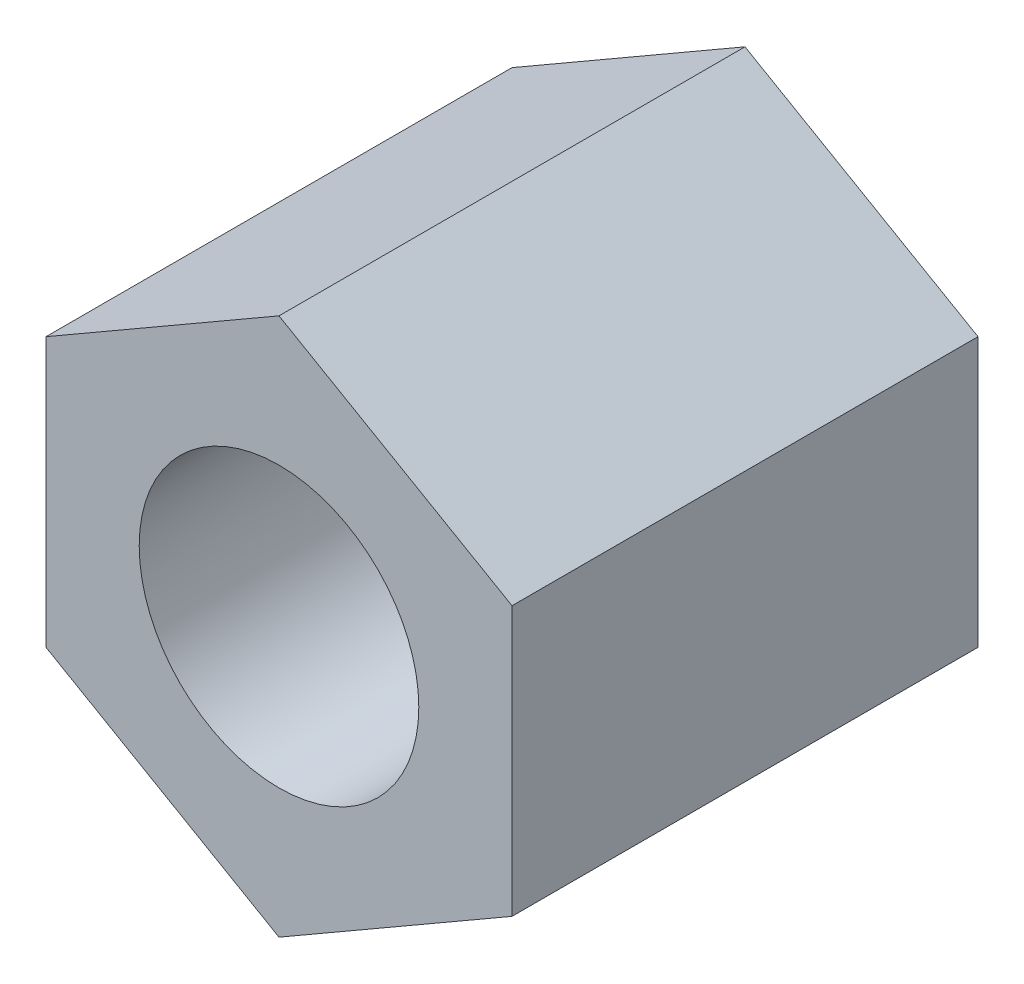
ISO-10303-21;
HEADER;
FILE_DESCRIPTION(('STEP AP214'),'2;1');
FILE_NAME('part.step','',(''),(''),'','','');
FILE_SCHEMA(('AUTOMOTIVE_DESIGN { 1 0 10303 214 1 1 1 1 }'));
ENDSEC;
DATA;
#1=APPLICATION_CONTEXT('core data for automotive mechanical design processes');
#2=APPLICATION_PROTOCOL_DEFINITION('international standard','automotive_design',2000,#1);
#3=PRODUCT_CONTEXT('',#1,'mechanical');
#4=PRODUCT('Part','Part','',(#3));
#5=PRODUCT_RELATED_PRODUCT_CATEGORY('part','',(#4));
#6=PRODUCT_DEFINITION_FORMATION('','',#4);
#7=PRODUCT_DEFINITION_CONTEXT('part definition',#1,'design');
#8=PRODUCT_DEFINITION('design','',#6,#7);
#9=PRODUCT_DEFINITION_SHAPE('','',#8);
#10=(LENGTH_UNIT() NAMED_UNIT(*) SI_UNIT(.MILLI.,.METRE.));
#11=(NAMED_UNIT(*) PLANE_ANGLE_UNIT() SI_UNIT($,.RADIAN.));
#12=(NAMED_UNIT(*) SI_UNIT($,.STERADIAN.) SOLID_ANGLE_UNIT());
#13=UNCERTAINTY_MEASURE_WITH_UNIT(LENGTH_MEASURE(1.E-05),#10,'distance_accuracy_value','');
#14=(GEOMETRIC_REPRESENTATION_CONTEXT(3) GLOBAL_UNCERTAINTY_ASSIGNED_CONTEXT((#13)) GLOBAL_UNIT_ASSIGNED_CONTEXT((#10,
#11,#12)) REPRESENTATION_CONTEXT('',''));
#15=CARTESIAN_POINT('',(0.,0.,0.));
#16=DIRECTION('',(0.,0.,1.));
#17=DIRECTION('',(1.,0.,0.));
#18=AXIS2_PLACEMENT_3D('',#15,#16,#17);
#19=CARTESIAN_POINT('',(0.,0.,5.));
#20=DIRECTION('',(0.,0.,1.));
#21=DIRECTION('',(1.,0.,0.));
#22=AXIS2_PLACEMENT_3D('',#19,#20,#21);
#23=PLANE('',#22);
#24=DIRECTION('',(0.866025403784441,-0.499999999999995,0.));
#25=VECTOR('',#24,1.);
#26=CARTESIAN_POINT('',(-2.49999999999997,-1.44337567297409,5.));
#27=LINE('',#26,#25);
#28=CARTESIAN_POINT('',(-2.49999999999997,-1.44337567297409,5.));
#29=VERTEX_POINT('',#28);
#30=CARTESIAN_POINT('',(0.,-2.88675134594811,5.));
#31=VERTEX_POINT('',#30);
#32=EDGE_CURVE('E129',#29,#31,#27,.T.);
#33=ORIENTED_EDGE('',*,*,#32,.T.);
#34=DIRECTION('',(0.866025403784438,0.500000000000001,0.));
#35=VECTOR('',#34,1.);
#36=CARTESIAN_POINT('',(0.,-2.88675134594811,5.));
#37=LINE('',#36,#35);
#38=CARTESIAN_POINT('',(2.49999999999999,-1.44337567297405,5.));
#39=VERTEX_POINT('',#38);
#40=EDGE_CURVE('E87',#31,#39,#37,.T.);
#41=ORIENTED_EDGE('',*,*,#40,.T.);
#42=DIRECTION('',(0.,1.,0.));
#43=VECTOR('',#42,1.);
#44=CARTESIAN_POINT('',(2.49999999999999,-1.44337567297405,5.));
#45=LINE('',#44,#43);
#46=CARTESIAN_POINT('',(2.49999999999998,1.44337567297407,5.));
#47=VERTEX_POINT('',#46);
#48=EDGE_CURVE('E100',#39,#47,#45,.T.);
#49=ORIENTED_EDGE('',*,*,#48,.T.);
#50=DIRECTION('',(-0.866025403784442,0.499999999999995,0.));
#51=VECTOR('',#50,1.);
#52=CARTESIAN_POINT('',(2.49999999999998,1.44337567297407,5.));
#53=LINE('',#52,#51);
#54=CARTESIAN_POINT('',(0.,2.88675134594811,5.));
#55=VERTEX_POINT('',#54);
#56=EDGE_CURVE('E94',#47,#55,#53,.T.);
#57=ORIENTED_EDGE('',*,*,#56,.T.);
#58=DIRECTION('',(-0.866025403784435,-0.500000000000007,0.));
#59=VECTOR('',#58,1.);
#60=CARTESIAN_POINT('',(0.,2.88675134594811,5.));
#61=LINE('',#60,#59);
#62=CARTESIAN_POINT('',(-2.5,1.44337567297403,5.));
#63=VERTEX_POINT('',#62);
#64=EDGE_CURVE('E98',#55,#63,#61,.T.);
#65=ORIENTED_EDGE('',*,*,#64,.T.);
#66=DIRECTION('',(0.,-1.,0.));
#67=VECTOR('',#66,1.);
#68=CARTESIAN_POINT('',(-2.5,1.44337567297403,5.));
#69=LINE('',#68,#67);
#70=EDGE_CURVE('E50',#63,#29,#69,.T.);
#71=ORIENTED_EDGE('',*,*,#70,.T.);
#72=EDGE_LOOP('',(#33,#41,#49,#57,#65,#71));
#73=FACE_BOUND('',#72,.T.);
#74=CARTESIAN_POINT('',(0.,0.,5.));
#75=DIRECTION('',(0.,0.,1.));
#76=DIRECTION('',(1.,0.,0.));
#77=AXIS2_PLACEMENT_3D('',#74,#75,#76);
#78=CIRCLE('',#77,1.5);
#79=CARTESIAN_POINT('',(1.5,0.,5.));
#80=VERTEX_POINT('',#79);
#81=EDGE_CURVE('E122',#80,#80,#78,.T.);
#82=ORIENTED_EDGE('',*,*,#81,.F.);
#83=EDGE_LOOP('',(#82));
#84=FACE_BOUND('',#83,.T.);
#85=ADVANCED_FACE('F33',(#73,#84),#23,.T.);
#86=CARTESIAN_POINT('',(0.,0.,0.));
#87=DIRECTION('',(0.,0.,1.));
#88=DIRECTION('',(1.,0.,0.));
#89=AXIS2_PLACEMENT_3D('',#86,#87,#88);
#90=PLANE('',#89);
#91=DIRECTION('',(0.866025403784441,-0.499999999999995,0.));
#92=VECTOR('',#91,1.);
#93=CARTESIAN_POINT('',(-2.49999999999997,-1.44337567297409,0.));
#94=LINE('',#93,#92);
#95=CARTESIAN_POINT('',(-2.49999999999997,-1.44337567297409,0.));
#96=VERTEX_POINT('',#95);
#97=CARTESIAN_POINT('',(0.,-2.88675134594811,0.));
#98=VERTEX_POINT('',#97);
#99=EDGE_CURVE('E118',#96,#98,#94,.T.);
#100=ORIENTED_EDGE('',*,*,#99,.F.);
#101=DIRECTION('',(0.,-1.,0.));
#102=VECTOR('',#101,1.);
#103=CARTESIAN_POINT('',(-2.5,1.44337567297403,0.));
#104=LINE('',#103,#102);
#105=CARTESIAN_POINT('',(-2.5,1.44337567297403,0.));
#106=VERTEX_POINT('',#105);
#107=EDGE_CURVE('E79',#106,#96,#104,.T.);
#108=ORIENTED_EDGE('',*,*,#107,.F.);
#109=DIRECTION('',(-0.866025403784435,-0.500000000000007,0.));
#110=VECTOR('',#109,1.);
#111=CARTESIAN_POINT('',(0.,2.88675134594811,0.));
#112=LINE('',#111,#110);
#113=CARTESIAN_POINT('',(0.,2.88675134594811,0.));
#114=VERTEX_POINT('',#113);
#115=EDGE_CURVE('E73',#114,#106,#112,.T.);
#116=ORIENTED_EDGE('',*,*,#115,.F.);
#117=DIRECTION('',(-0.866025403784442,0.499999999999995,0.));
#118=VECTOR('',#117,1.);
#119=CARTESIAN_POINT('',(2.49999999999998,1.44337567297407,0.));
#120=LINE('',#119,#118);
#121=CARTESIAN_POINT('',(2.49999999999998,1.44337567297407,0.));
#122=VERTEX_POINT('',#121);
#123=EDGE_CURVE('E108',#122,#114,#120,.T.);
#124=ORIENTED_EDGE('',*,*,#123,.F.);
#125=DIRECTION('',(0.,1.,0.));
#126=VECTOR('',#125,1.);
#127=CARTESIAN_POINT('',(2.49999999999999,-1.44337567297405,0.));
#128=LINE('',#127,#126);
#129=CARTESIAN_POINT('',(2.49999999999999,-1.44337567297405,0.));
#130=VERTEX_POINT('',#129);
#131=EDGE_CURVE('E124',#130,#122,#128,.T.);
#132=ORIENTED_EDGE('',*,*,#131,.F.);
#133=DIRECTION('',(0.866025403784438,0.500000000000001,0.));
#134=VECTOR('',#133,1.);
#135=CARTESIAN_POINT('',(0.,-2.88675134594811,0.));
#136=LINE('',#135,#134);
#137=EDGE_CURVE('E121',#98,#130,#136,.T.);
#138=ORIENTED_EDGE('',*,*,#137,.F.);
#139=EDGE_LOOP('',(#100,#108,#116,#124,#132,#138));
#140=FACE_BOUND('',#139,.T.);
#141=CARTESIAN_POINT('',(0.,0.,0.));
#142=DIRECTION('',(0.,0.,1.));
#143=DIRECTION('',(1.,0.,0.));
#144=AXIS2_PLACEMENT_3D('',#141,#142,#143);
#145=CIRCLE('',#144,1.5);
#146=CARTESIAN_POINT('',(1.5,0.,0.));
#147=VERTEX_POINT('',#146);
#148=EDGE_CURVE('E222',#147,#147,#145,.T.);
#149=ORIENTED_EDGE('',*,*,#148,.T.);
#150=EDGE_LOOP('',(#149));
#151=FACE_BOUND('',#150,.T.);
#152=ADVANCED_FACE('F138',(#140,#151),#90,.F.);
#153=CARTESIAN_POINT('',(-2.49999999999997,-1.44337567297409,5.));
#154=DIRECTION('',(0.499999999999995,0.866025403784442,0.));
#155=DIRECTION('',(-0.866025403784442,0.499999999999995,0.));
#156=AXIS2_PLACEMENT_3D('',#153,#154,#155);
#157=PLANE('',#156);
#158=ORIENTED_EDGE('',*,*,#99,.T.);
#159=DIRECTION('',(0.,0.,-1.));
#160=VECTOR('',#159,1.);
#161=CARTESIAN_POINT('',(0.,-2.88675134594811,5.));
#162=LINE('',#161,#160);
#163=EDGE_CURVE('E11',#31,#98,#162,.T.);
#164=ORIENTED_EDGE('',*,*,#163,.F.);
#165=ORIENTED_EDGE('',*,*,#32,.F.);
#166=DIRECTION('',(0.,0.,-1.));
#167=VECTOR('',#166,1.);
#168=CARTESIAN_POINT('',(-2.49999999999997,-1.44337567297409,5.));
#169=LINE('',#168,#167);
#170=EDGE_CURVE('E114',#29,#96,#169,.T.);
#171=ORIENTED_EDGE('',*,*,#170,.T.);
#172=EDGE_LOOP('',(#158,#164,#165,#171));
#173=FACE_BOUND('',#172,.T.);
#174=ADVANCED_FACE('F35',(#173),#157,.F.);
#175=CARTESIAN_POINT('',(0.,-2.88675134594811,5.));
#176=DIRECTION('',(-0.500000000000001,0.866025403784438,0.));
#177=DIRECTION('',(-0.866025403784438,-0.500000000000001,0.));
#178=AXIS2_PLACEMENT_3D('',#175,#176,#177);
#179=PLANE('',#178);
#180=ORIENTED_EDGE('',*,*,#137,.T.);
#181=DIRECTION('',(0.,0.,-1.));
#182=VECTOR('',#181,1.);
#183=CARTESIAN_POINT('',(2.49999999999999,-1.44337567297405,5.));
#184=LINE('',#183,#182);
#185=EDGE_CURVE('E42',#39,#130,#184,.T.);
#186=ORIENTED_EDGE('',*,*,#185,.F.);
#187=ORIENTED_EDGE('',*,*,#40,.F.);
#188=ORIENTED_EDGE('',*,*,#163,.T.);
#189=EDGE_LOOP('',(#180,#186,#187,#188));
#190=FACE_BOUND('',#189,.T.);
#191=ADVANCED_FACE('F163',(#190),#179,.F.);
#192=CARTESIAN_POINT('',(2.49999999999999,-1.44337567297405,5.));
#193=DIRECTION('',(-1.,0.,0.));
#194=DIRECTION('',(0.,-1.,0.));
#195=AXIS2_PLACEMENT_3D('',#192,#193,#194);
#196=PLANE('',#195);
#197=ORIENTED_EDGE('',*,*,#131,.T.);
#198=DIRECTION('',(0.,0.,-1.));
#199=VECTOR('',#198,1.);
#200=CARTESIAN_POINT('',(2.49999999999998,1.44337567297407,5.));
#201=LINE('',#200,#199);
#202=EDGE_CURVE('E109',#47,#122,#201,.T.);
#203=ORIENTED_EDGE('',*,*,#202,.F.);
#204=ORIENTED_EDGE('',*,*,#48,.F.);
#205=ORIENTED_EDGE('',*,*,#185,.T.);
#206=EDGE_LOOP('',(#197,#203,#204,#205));
#207=FACE_BOUND('',#206,.T.);
#208=ADVANCED_FACE('F135',(#207),#196,.F.);
#209=CARTESIAN_POINT('',(2.49999999999998,1.44337567297407,5.));
#210=DIRECTION('',(-0.499999999999995,-0.866025403784442,0.));
#211=DIRECTION('',(0.866025403784442,-0.499999999999995,0.));
#212=AXIS2_PLACEMENT_3D('',#209,#210,#211);
#213=PLANE('',#212);
#214=ORIENTED_EDGE('',*,*,#123,.T.);
#215=DIRECTION('',(0.,0.,-1.));
#216=VECTOR('',#215,1.);
#217=CARTESIAN_POINT('',(0.,2.88675134594811,5.));
#218=LINE('',#217,#216);
#219=EDGE_CURVE('E105',#55,#114,#218,.T.);
#220=ORIENTED_EDGE('',*,*,#219,.F.);
#221=ORIENTED_EDGE('',*,*,#56,.F.);
#222=ORIENTED_EDGE('',*,*,#202,.T.);
#223=EDGE_LOOP('',(#214,#220,#221,#222));
#224=FACE_BOUND('',#223,.T.);
#225=ADVANCED_FACE('F106',(#224),#213,.F.);
#226=CARTESIAN_POINT('',(0.,2.88675134594811,5.));
#227=DIRECTION('',(0.500000000000007,-0.866025403784435,0.));
#228=DIRECTION('',(0.866025403784435,0.500000000000007,0.));
#229=AXIS2_PLACEMENT_3D('',#226,#227,#228);
#230=PLANE('',#229);
#231=ORIENTED_EDGE('',*,*,#115,.T.);
#232=DIRECTION('',(0.,0.,-1.));
#233=VECTOR('',#232,1.);
#234=CARTESIAN_POINT('',(-2.5,1.44337567297403,5.));
#235=LINE('',#234,#233);
#236=EDGE_CURVE('E110',#63,#106,#235,.T.);
#237=ORIENTED_EDGE('',*,*,#236,.F.);
#238=ORIENTED_EDGE('',*,*,#64,.F.);
#239=ORIENTED_EDGE('',*,*,#219,.T.);
#240=EDGE_LOOP('',(#231,#237,#238,#239));
#241=FACE_BOUND('',#240,.T.);
#242=ADVANCED_FACE('F112',(#241),#230,.F.);
#243=CARTESIAN_POINT('',(-2.5,1.44337567297403,5.));
#244=DIRECTION('',(1.,0.,0.));
#245=DIRECTION('',(0.,1.,0.));
#246=AXIS2_PLACEMENT_3D('',#243,#244,#245);
#247=PLANE('',#246);
#248=ORIENTED_EDGE('',*,*,#107,.T.);
#249=ORIENTED_EDGE('',*,*,#170,.F.);
#250=ORIENTED_EDGE('',*,*,#70,.F.);
#251=ORIENTED_EDGE('',*,*,#236,.T.);
#252=EDGE_LOOP('',(#248,#249,#250,#251));
#253=FACE_BOUND('',#252,.T.);
#254=ADVANCED_FACE('F143',(#253),#247,.F.);
#255=CARTESIAN_POINT('',(0.,0.,5.));
#256=DIRECTION('',(0.,0.,-1.));
#257=DIRECTION('',(-1.,0.,0.));
#258=AXIS2_PLACEMENT_3D('',#255,#256,#257);
#259=CYLINDRICAL_SURFACE('',#258,1.5);
#260=ORIENTED_EDGE('',*,*,#81,.T.);
#261=EDGE_LOOP('',(#260));
#262=FACE_BOUND('',#261,.T.);
#263=ORIENTED_EDGE('',*,*,#148,.F.);
#264=EDGE_LOOP('',(#263));
#265=FACE_BOUND('',#264,.T.);
#266=ADVANCED_FACE('F145',(#262,#265),#259,.F.);
#267=CLOSED_SHELL('',(#85,#152,#174,#191,#208,#225,#242,#254,#266));
#268=MANIFOLD_SOLID_BREP('B2',#267);
#269=ADVANCED_BREP_SHAPE_REPRESENTATION('',(#18,#268),#14);
#270=SHAPE_DEFINITION_REPRESENTATION(#9,#269);
ENDSEC;
END-ISO-10303-21;
